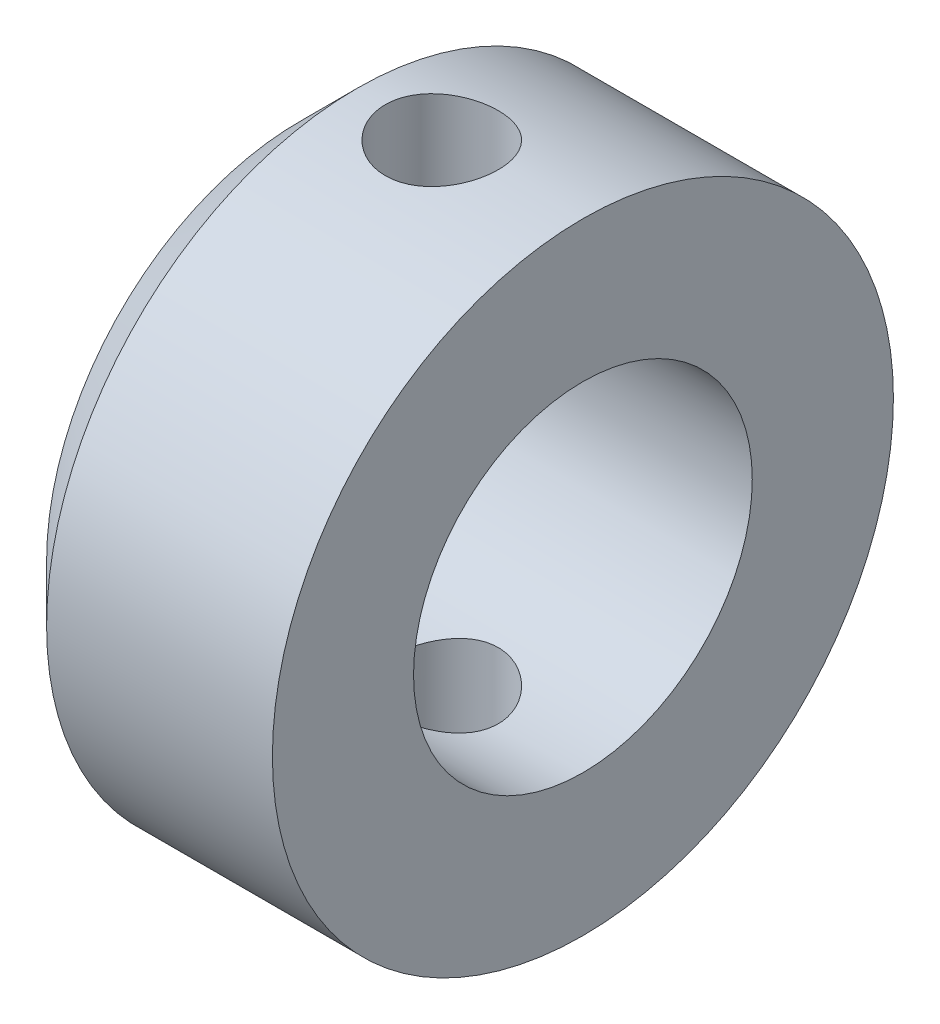
ISO-10303-21;
HEADER;
FILE_DESCRIPTION(('STEP AP214'),'2;1');
FILE_NAME('part.step','',(''),(''),'','','');
FILE_SCHEMA(('AUTOMOTIVE_DESIGN { 1 0 10303 214 1 1 1 1 }'));
ENDSEC;
DATA;
#1=APPLICATION_CONTEXT('core data for automotive mechanical design processes');
#2=APPLICATION_PROTOCOL_DEFINITION('international standard','automotive_design',2000,#1);
#3=PRODUCT_CONTEXT('',#1,'mechanical');
#4=PRODUCT('Part','Part','',(#3));
#5=PRODUCT_RELATED_PRODUCT_CATEGORY('part','',(#4));
#6=PRODUCT_DEFINITION_FORMATION('','',#4);
#7=PRODUCT_DEFINITION_CONTEXT('part definition',#1,'design');
#8=PRODUCT_DEFINITION('design','',#6,#7);
#9=PRODUCT_DEFINITION_SHAPE('','',#8);
#10=(LENGTH_UNIT() NAMED_UNIT(*) SI_UNIT(.MILLI.,.METRE.));
#11=(NAMED_UNIT(*) PLANE_ANGLE_UNIT() SI_UNIT($,.RADIAN.));
#12=(NAMED_UNIT(*) SI_UNIT($,.STERADIAN.) SOLID_ANGLE_UNIT());
#13=UNCERTAINTY_MEASURE_WITH_UNIT(LENGTH_MEASURE(1.E-05),#10,'distance_accuracy_value','');
#14=(GEOMETRIC_REPRESENTATION_CONTEXT(3) GLOBAL_UNCERTAINTY_ASSIGNED_CONTEXT((#13)) GLOBAL_UNIT_ASSIGNED_CONTEXT((#10,
#11,#12)) REPRESENTATION_CONTEXT('',''));
#15=CARTESIAN_POINT('',(0.,0.,0.));
#16=DIRECTION('',(0.,0.,1.));
#17=DIRECTION('',(1.,0.,0.));
#18=AXIS2_PLACEMENT_3D('',#15,#16,#17);
#19=CARTESIAN_POINT('',(0.,0.,0.));
#20=DIRECTION('',(1.,0.,0.));
#21=DIRECTION('',(0.,0.,-1.));
#22=AXIS2_PLACEMENT_3D('',#19,#20,#21);
#23=PLANE('',#22);
#24=CARTESIAN_POINT('',(0.,0.,0.));
#25=DIRECTION('',(-1.,0.,0.));
#26=DIRECTION('',(0.,0.,1.));
#27=AXIS2_PLACEMENT_3D('',#24,#25,#26);
#28=CIRCLE('',#27,6.);
#29=CARTESIAN_POINT('',(0.,0.,6.));
#30=VERTEX_POINT('',#29);
#31=EDGE_CURVE('E97',#30,#30,#28,.T.);
#32=ORIENTED_EDGE('',*,*,#31,.T.);
#33=EDGE_LOOP('',(#32));
#34=FACE_BOUND('',#33,.T.);
#35=CARTESIAN_POINT('',(0.,0.,0.));
#36=DIRECTION('',(1.,0.,0.));
#37=DIRECTION('',(0.,0.,-1.));
#38=AXIS2_PLACEMENT_3D('',#35,#36,#37);
#39=CIRCLE('',#38,11.);
#40=CARTESIAN_POINT('',(0.,0.,-11.));
#41=VERTEX_POINT('',#40);
#42=EDGE_CURVE('E52',#41,#41,#39,.T.);
#43=ORIENTED_EDGE('',*,*,#42,.T.);
#44=EDGE_LOOP('',(#43));
#45=FACE_BOUND('',#44,.T.);
#46=ADVANCED_FACE('F34',(#34,#45),#23,.T.);
#47=CARTESIAN_POINT('',(0.,0.,0.));
#48=DIRECTION('',(1.,0.,0.));
#49=DIRECTION('',(0.,0.,-1.));
#50=AXIS2_PLACEMENT_3D('',#47,#48,#49);
#51=CYLINDRICAL_SURFACE('',#50,11.);
#52=CARTESIAN_POINT('',(-3.,-11.,0.));
#53=CARTESIAN_POINT('',(-3.00000431866068,-10.9999980072786,0.111357271644373));
#54=CARTESIAN_POINT('',(-3.00933175748266,-10.9982915273343,0.222771449918202));
#55=CARTESIAN_POINT('',(-3.04637346602493,-10.99164847502,0.442464406848309));
#56=CARTESIAN_POINT('',(-3.07410364858137,-10.9867091072254,0.550740387266074));
#57=CARTESIAN_POINT('',(-3.14707712967099,-10.9741532323507,0.760947572513747));
#58=CARTESIAN_POINT('',(-3.19230503218977,-10.9665390793192,0.862884263930173));
#59=CARTESIAN_POINT('',(-3.29894733119179,-10.949466714983,1.0577120033845));
#60=CARTESIAN_POINT('',(-3.36036026518819,-10.9400086703132,1.15060386767905));
#61=CARTESIAN_POINT('',(-3.4983659096427,-10.9201743349983,1.32576444051238));
#62=CARTESIAN_POINT('',(-3.57510584198076,-10.9097897259708,1.40791622603345));
#63=CARTESIAN_POINT('',(-3.74127035408983,-10.8893349521181,1.55825357341079));
#64=CARTESIAN_POINT('',(-3.83069581168915,-10.8792648091126,1.62643816794977));
#65=CARTESIAN_POINT('',(-4.02051272945978,-10.8604984020977,1.74738695016477));
#66=CARTESIAN_POINT('',(-4.12098053523038,-10.851812871101,1.80003313265556));
#67=CARTESIAN_POINT('',(-4.32951865032397,-10.836915832769,1.88765546949978));
#68=CARTESIAN_POINT('',(-4.43758834402504,-10.8307041253674,1.92263305283275));
#69=CARTESIAN_POINT('',(-4.6570146493566,-10.8215415351671,1.97355197711315));
#70=CARTESIAN_POINT('',(-4.76832259170963,-10.8185558462234,1.98969666425445));
#71=CARTESIAN_POINT('',(-4.99210440731457,-10.8160783143231,2.00312248736688));
#72=CARTESIAN_POINT('',(-5.10457818151604,-10.8165861769405,2.00040521296643));
#73=CARTESIAN_POINT('',(-5.32603191413302,-10.8210066504918,1.97634934427));
#74=CARTESIAN_POINT('',(-5.43503786789573,-10.8248771281426,1.95524117699072));
#75=CARTESIAN_POINT('',(-5.64793501836717,-10.8355206127391,1.89536523340027));
#76=CARTESIAN_POINT('',(-5.75182600935179,-10.8422937363232,1.85659674743188));
#77=CARTESIAN_POINT('',(-5.95222279077874,-10.8580238155272,1.76227297789296));
#78=CARTESIAN_POINT('',(-6.04868344266613,-10.8669929171435,1.7066239037154));
#79=CARTESIAN_POINT('',(-6.2309847369453,-10.8860962201172,1.58018503374043));
#80=CARTESIAN_POINT('',(-6.31682436264624,-10.8962305328347,1.50939379023585));
#81=CARTESIAN_POINT('',(-6.47677899644438,-10.9167064080855,1.35343399418352));
#82=CARTESIAN_POINT('',(-6.55070168843692,-10.9270488181647,1.2680681726569));
#83=CARTESIAN_POINT('',(-6.68320513348084,-10.9466375043709,1.08604454069331));
#84=CARTESIAN_POINT('',(-6.74178574962127,-10.9558837707156,0.989386629498159));
#85=CARTESIAN_POINT('',(-6.84196738978503,-10.9722553782534,0.787327598497299));
#86=CARTESIAN_POINT('',(-6.88354926869598,-10.9793783255922,0.681916780395495));
#87=CARTESIAN_POINT('',(-6.94836319249371,-10.9906820547088,0.465448414462669));
#88=CARTESIAN_POINT('',(-6.97159706857391,-10.994863130091,0.354391431316066));
#89=CARTESIAN_POINT('',(-6.99878976191912,-10.9997719337866,0.1314386495785));
#90=CARTESIAN_POINT('',(-7.00301222345408,-11.0005468934114,0.0195760121089348));
#91=CARTESIAN_POINT('',(-6.99276820181851,-10.998686302475,-0.203257238970966));
#92=CARTESIAN_POINT('',(-6.97830257992826,-10.9960509090871,-0.314227893453081));
#93=CARTESIAN_POINT('',(-6.93131225043813,-10.9876950863245,-0.531297097592757));
#94=CARTESIAN_POINT('',(-6.89892013081718,-10.9819973157216,-0.637425297458317));
#95=CARTESIAN_POINT('',(-6.81713917147806,-10.9681529512222,-0.84274471375661));
#96=CARTESIAN_POINT('',(-6.7677492323023,-10.9600061989244,-0.941935480960947));
#97=CARTESIAN_POINT('',(-6.65278536219707,-10.9420497958484,-1.13169524707493));
#98=CARTESIAN_POINT('',(-6.58704931284408,-10.932223816146,-1.22216445208488));
#99=CARTESIAN_POINT('',(-6.44147962332891,-10.9120428807109,-1.39088213822347));
#100=CARTESIAN_POINT('',(-6.36164475058806,-10.9016878787851,-1.46912954974332));
#101=CARTESIAN_POINT('',(-6.18895311855151,-10.8814603955764,-1.6121773788768));
#102=CARTESIAN_POINT('',(-6.09594669347414,-10.8715955212189,-1.67679836741418));
#103=CARTESIAN_POINT('',(-5.90024381859352,-10.8536151008102,-1.78949986552014));
#104=CARTESIAN_POINT('',(-5.79754771531562,-10.8454994922354,-1.83758096630795));
#105=CARTESIAN_POINT('',(-5.58584925030826,-10.8319954461548,-1.91557945241746));
#106=CARTESIAN_POINT('',(-5.47687876926195,-10.8265943801675,-1.9455810786184));
#107=CARTESIAN_POINT('',(-5.25533701136893,-10.8191012654539,-1.98683040178554));
#108=CARTESIAN_POINT('',(-5.14276611515108,-10.8170088681136,-1.99808007453629));
#109=CARTESIAN_POINT('',(-4.91901462453636,-10.8163869388262,-2.00144313663184));
#110=CARTESIAN_POINT('',(-4.80783832856145,-10.8178047454411,-1.99383937001232));
#111=CARTESIAN_POINT('',(-4.58837636198258,-10.8239270874703,-1.96032846912814));
#112=CARTESIAN_POINT('',(-4.48009067650571,-10.8286316059701,-1.93442142905718));
#113=CARTESIAN_POINT('',(-4.26962380260463,-10.8407757208091,-1.86515567158476));
#114=CARTESIAN_POINT('',(-4.16743283977657,-10.8482107929975,-1.82182581019232));
#115=CARTESIAN_POINT('',(-3.97172555283527,-10.8649817751485,-1.71897473664822));
#116=CARTESIAN_POINT('',(-3.87820979115442,-10.8743178082294,-1.65945247569007));
#117=CARTESIAN_POINT('',(-3.70108712540438,-10.8940032465147,-1.52491543662799));
#118=CARTESIAN_POINT('',(-3.61763843012924,-10.9043650783111,-1.44969415553099));
#119=CARTESIAN_POINT('',(-3.46445291898781,-10.9248399206865,-1.28632651423364));
#120=CARTESIAN_POINT('',(-3.39471925960776,-10.9349528735191,-1.19817718680093));
#121=CARTESIAN_POINT('',(-3.27039970287652,-10.9538897429719,-1.0105711896463));
#122=CARTESIAN_POINT('',(-3.21594581481987,-10.9627021317343,-0.911025849790496));
#123=CARTESIAN_POINT('',(-3.12462078392595,-10.9779326099335,-0.704073905086345));
#124=CARTESIAN_POINT('',(-3.08773284072168,-10.9843529858473,-0.59667492548667));
#125=CARTESIAN_POINT('',(-3.04022456969781,-10.9927407037649,-0.407441749458405));
#126=CARTESIAN_POINT('',(-3.02516566703965,-10.9954478027358,-0.326725427276489));
#127=CARTESIAN_POINT('',(-3.0050519062051,-10.9990781643304,-0.164016342132203));
#128=CARTESIAN_POINT('',(-2.99999681895823,-11.0000014678,-0.082023608440833));
#129=CARTESIAN_POINT('',(-3.,-11.,0.));
#130=B_SPLINE_CURVE_WITH_KNOTS('',3,(#52,#53,#54,#55,#56,#57,#58,#59,#60,#61,#62,#63,#64,#65,
#66,#67,#68,#69,#70,#71,#72,#73,#74,#75,#76,#77,#78,#79,#80,#81,#82,#83,#84,#85,#86,#87,#88,#89,
#90,#91,#92,#93,#94,#95,#96,#97,#98,#99,#100,#101,#102,#103,#104,#105,#106,#107,#108,#109,#110,
#111,#112,#113,#114,#115,#116,#117,#118,#119,#120,#121,#122,#123,#124,#125,#126,#127,#128,#129),
.UNSPECIFIED.,.T.,.F.,(4,2,2,2,2,2,2,2,2,2,2,2,2,2,2,2,2,2,2,2,2,2,2,2,2,2,2,2,2,2,2,2,2,2,2,2,
2,2,4),(0.,0.333771891552332,0.667832772072589,1.00160038286674,1.3353378446015,
1.67245014596885,2.00958578663078,2.3492195220365,2.6888257845573,3.02473021172645,
3.36060633024203,3.69233367290895,4.02407434678871,4.35769306461625,4.69134369321255,
5.02993210441872,5.36852353704647,5.70749527023812,6.04643316861453,6.38065600997364,
6.71486344850797,7.0466314328543,7.37842088074221,7.71364226795666,8.04889297616123,
8.38831506130459,8.72772501252475,9.06554101076157,9.40332141303603,9.73606509730373,
10.0688070691931,10.4010002025896,10.733214857769,11.0701111453004,11.4070848782946,
11.7468860454293,12.0863615649817,12.3322171022956,12.5780670098676),.UNSPECIFIED.);
#131=CARTESIAN_POINT('',(-3.,-11.,0.));
#132=VERTEX_POINT('',#131);
#133=EDGE_CURVE('E79',#132,#132,#130,.T.);
#134=ORIENTED_EDGE('',*,*,#133,.F.);
#135=EDGE_LOOP('',(#134));
#136=FACE_BOUND('',#135,.T.);
#137=CARTESIAN_POINT('',(-5.,10.816653826392,2.));
#138=CARTESIAN_POINT('',(-4.88865987742704,10.8166559469823,1.99999566748834));
#139=CARTESIAN_POINT('',(-4.777262808712,10.818391586416,1.9906710042305));
#140=CARTESIAN_POINT('',(-4.55760538412703,10.825138630904,1.953641319662));
#141=CARTESIAN_POINT('',(-4.44934784033072,10.8301528833982,1.92592032102069));
#142=CARTESIAN_POINT('',(-4.23917968698149,10.8428709030557,1.85297369289719));
#143=CARTESIAN_POINT('',(-4.13726343469195,10.8505722376174,1.80776389192774));
#144=CARTESIAN_POINT('',(-3.94247010837104,10.8677937983012,1.70116425408316));
#145=CARTESIAN_POINT('',(-3.84959224198363,10.8773138647657,1.63977583726981));
#146=CARTESIAN_POINT('',(-3.67441655255825,10.8972247379328,1.50179524823966));
#147=CARTESIAN_POINT('',(-3.59223992576605,10.9076236306456,1.42505035347811));
#148=CARTESIAN_POINT('',(-3.44185443716558,10.9280489317643,1.25886539634162));
#149=CARTESIAN_POINT('',(-3.37364646635462,10.9380753163762,1.1694245247635));
#150=CARTESIAN_POINT('',(-3.25267268154977,10.9567122399244,0.979593418999868));
#151=CARTESIAN_POINT('',(-3.2000207300042,10.965312146403,0.879129490479889));
#152=CARTESIAN_POINT('',(-3.11238666697386,10.9800367733651,0.670599774437612));
#153=CARTESIAN_POINT('',(-3.07740318949064,10.98616168519,0.562534575326681));
#154=CARTESIAN_POINT('',(-3.02647276674455,10.9951891058833,0.34312483782086));
#155=CARTESIAN_POINT('',(-3.01032168567929,10.9981261454525,0.231829128518771));
#156=CARTESIAN_POINT('',(-2.9968788325376,11.0005658088946,0.0080714729659267));
#157=CARTESIAN_POINT('',(-2.99958554642845,11.0000687084839,-0.104390378935036));
#158=CARTESIAN_POINT('',(-3.02362414207791,10.9957231855211,-0.325889196140737));
#159=CARTESIAN_POINT('',(-3.04473625351444,10.9919143087691,-0.434950900053344));
#160=CARTESIAN_POINT('',(-3.10463919746151,10.9814174690798,-0.647957490603361));
#161=CARTESIAN_POINT('',(-3.14343064538623,10.974729405919,-0.751902198979601));
#162=CARTESIAN_POINT('',(-3.23780305977915,10.9591592037236,-0.952366225453844));
#163=CARTESIAN_POINT('',(-3.29347264403384,10.9502655302338,-1.04884289251746));
#164=CARTESIAN_POINT('',(-3.41995588992469,10.9312689682172,-1.23116763357292));
#165=CARTESIAN_POINT('',(-3.49077100293549,10.9211659638428,-1.31701468769822));
#166=CARTESIAN_POINT('',(-3.64674845457927,10.9006990809284,-1.47694445054394));
#167=CARTESIAN_POINT('',(-3.73210301791898,10.8903335415211,-1.55083959404949));
#168=CARTESIAN_POINT('',(-3.91409406392092,10.8706496206858,-1.68329271964165));
#169=CARTESIAN_POINT('',(-4.01073069276526,10.861331252829,-1.74185050296967));
#170=CARTESIAN_POINT('',(-4.21278251048682,10.8447947340983,-1.84201538249092));
#171=CARTESIAN_POINT('',(-4.31821083163979,10.8375798001274,-1.88359655385222));
#172=CARTESIAN_POINT('',(-4.53471744988837,10.8261173347694,-1.94840376886998));
#173=CARTESIAN_POINT('',(-4.64579514651115,10.8218694887144,-1.97163175896675));
#174=CARTESIAN_POINT('',(-4.86875980120541,10.8168840409274,-1.99880217851546));
#175=CARTESIAN_POINT('',(-4.98061293266964,10.8160975038278,-2.00301348489164));
#176=CARTESIAN_POINT('',(-5.20342455056108,10.8179929515389,-1.99275054778849));
#177=CARTESIAN_POINT('',(-5.31438307821397,10.8206747755886,-1.97827717035788));
#178=CARTESIAN_POINT('',(-5.53138034405228,10.8291592937867,-1.93128609638897));
#179=CARTESIAN_POINT('',(-5.63745038400803,10.8349378000789,-1.89890818855376));
#180=CARTESIAN_POINT('',(-5.84265971882844,10.8489439080076,-1.81717497571878));
#181=CARTESIAN_POINT('',(-5.94179852908567,10.8571716806773,-1.76781848506108));
#182=CARTESIAN_POINT('',(-6.13151919601524,10.8752613415266,-1.65290586187994));
#183=CARTESIAN_POINT('',(-6.22199611808438,10.8851400484298,-1.58717917941567));
#184=CARTESIAN_POINT('',(-6.39073369159775,10.9053706629202,-1.44162304950737));
#185=CARTESIAN_POINT('',(-6.46899331199965,10.91572261035,-1.36179241301325));
#186=CARTESIAN_POINT('',(-6.61207284614978,10.9358898604531,-1.18909630007261));
#187=CARTESIAN_POINT('',(-6.67671235536181,10.9456968282676,-1.09608023252377));
#188=CARTESIAN_POINT('',(-6.789446306083,10.9635308137777,-0.900352619793533));
#189=CARTESIAN_POINT('',(-6.83754135727717,10.9715578970606,-0.79764143206785));
#190=CARTESIAN_POINT('',(-6.91554803863644,10.9848917263157,-0.585948218345343));
#191=CARTESIAN_POINT('',(-6.94554990487653,10.9902119510479,-0.477000329353953));
#192=CARTESIAN_POINT('',(-6.98680734329716,10.9975899747809,-0.255506648963482));
#193=CARTESIAN_POINT('',(-6.99806476513671,10.9996480956777,-0.142961213679232));
#194=CARTESIAN_POINT('',(-7.00145252110552,11.0002641421388,0.0807996190288168));
#195=CARTESIAN_POINT('',(-6.99385588848469,10.9988720323112,0.192010837925448));
#196=CARTESIAN_POINT('',(-6.96034705357607,10.9928473390214,0.411544538990866));
#197=CARTESIAN_POINT('',(-6.93443500480099,10.9882147827193,0.519867045363826));
#198=CARTESIAN_POINT('',(-6.86514309651073,10.9762290690773,0.730415433440432));
#199=CARTESIAN_POINT('',(-6.82179065462445,10.96888018348,0.832650596646204));
#200=CARTESIAN_POINT('',(-6.71888059719124,10.9522592239203,1.02843701194217));
#201=CARTESIAN_POINT('',(-6.65932198372257,10.9429870315355,1.12198772879735));
#202=CARTESIAN_POINT('',(-6.5247423614381,10.9233859020729,1.29911459753549));
#203=CARTESIAN_POINT('',(-6.44952330461567,10.9130443794735,1.38253889858449));
#204=CARTESIAN_POINT('',(-6.28617048330647,10.8925517029222,1.53567622355087));
#205=CARTESIAN_POINT('',(-6.19803369143839,10.8824005942262,1.60538602436339));
#206=CARTESIAN_POINT('',(-6.01044032439888,10.8633428283932,1.72967671803608));
#207=CARTESIAN_POINT('',(-5.91089276068865,10.8544476470463,1.78412208501857));
#208=CARTESIAN_POINT('',(-5.70393672327402,10.8390461745677,1.87543058906983));
#209=CARTESIAN_POINT('',(-5.59653590839219,10.8325375922296,1.9123105996278));
#210=CARTESIAN_POINT('',(-5.40732331556775,10.8240281075057,1.95979896205519));
#211=CARTESIAN_POINT('',(-5.32663073739139,10.821278872104,1.97484899189766));
#212=CARTESIAN_POINT('',(-5.16396904796782,10.8175909727573,1.99495098425024));
#213=CARTESIAN_POINT('',(-5.08199996793035,10.8166522646159,2.00000319081575));
#214=CARTESIAN_POINT('',(-5.,10.816653826392,2.));
#215=B_SPLINE_CURVE_WITH_KNOTS('',3,(#137,#138,#139,#140,#141,#142,#143,#144,#145,#146,#147,
#148,#149,#150,#151,#152,#153,#154,#155,#156,#157,#158,#159,#160,#161,#162,#163,#164,#165,#166,
#167,#168,#169,#170,#171,#172,#173,#174,#175,#176,#177,#178,#179,#180,#181,#182,#183,#184,#185,
#186,#187,#188,#189,#190,#191,#192,#193,#194,#195,#196,#197,#198,#199,#200,#201,#202,#203,#204,
#205,#206,#207,#208,#209,#210,#211,#212,#213,#214),.UNSPECIFIED.,.T.,.F.,(4,2,2,2,2,2,2,2,2,2,2,
2,2,2,2,2,2,2,2,2,2,2,2,2,2,2,2,2,2,2,2,2,2,2,2,2,2,2,4),(0.,0.333720352628771,
0.667730923425361,1.00143989738151,1.33511959011686,1.6722993511526,2.00950061266478,
2.34911212511978,2.6886973772514,3.02456639415963,3.3604084455173,3.69229445292966,
4.02419201411038,4.35786328487979,4.69156654523441,5.03008350848145,5.36860485839155,
5.70764124486732,6.04664167012789,6.3808336464698,6.71501013332594,7.04661365662176,
7.37824034134338,7.71347820234125,8.04874433945132,8.38820522569594,8.72765360102077,
9.06539473675368,9.40310254298626,9.73594847886933,10.0687916249998,10.4011135484041,
10.7334559397116,11.0702887970716,11.4072007206838,11.7470154829573,12.0865031534681,
12.3322881015162,12.5780670496697),.UNSPECIFIED.);
#216=CARTESIAN_POINT('',(-5.,10.816653826392,2.));
#217=VERTEX_POINT('',#216);
#218=EDGE_CURVE('E73',#217,#217,#215,.T.);
#219=ORIENTED_EDGE('',*,*,#218,.F.);
#220=EDGE_LOOP('',(#219));
#221=FACE_BOUND('',#220,.T.);
#222=CARTESIAN_POINT('',(-7.99999999999999,0.,0.));
#223=DIRECTION('',(-1.,0.,0.));
#224=DIRECTION('',(0.,0.,1.));
#225=AXIS2_PLACEMENT_3D('',#222,#223,#224);
#226=CIRCLE('',#225,11.);
#227=CARTESIAN_POINT('',(-7.99999999999999,0.,11.));
#228=VERTEX_POINT('',#227);
#229=EDGE_CURVE('E47',#228,#228,#226,.F.);
#230=ORIENTED_EDGE('',*,*,#229,.T.);
#231=EDGE_LOOP('',(#230));
#232=FACE_BOUND('',#231,.T.);
#233=ORIENTED_EDGE('',*,*,#42,.F.);
#234=EDGE_LOOP('',(#233));
#235=FACE_BOUND('',#234,.T.);
#236=ADVANCED_FACE('F84',(#136,#221,#232,#235),#51,.T.);
#237=CARTESIAN_POINT('',(-9.99999999999999,11.,0.));
#238=DIRECTION('',(-1.,0.,0.));
#239=DIRECTION('',(0.,0.,1.));
#240=AXIS2_PLACEMENT_3D('',#237,#238,#239);
#241=PLANE('',#240);
#242=CARTESIAN_POINT('',(-9.99999999999999,0.,0.));
#243=DIRECTION('',(-1.,0.,0.));
#244=DIRECTION('',(0.,0.,1.));
#245=AXIS2_PLACEMENT_3D('',#242,#243,#244);
#246=CIRCLE('',#245,6.);
#247=CARTESIAN_POINT('',(-9.99999999999999,0.,6.));
#248=VERTEX_POINT('',#247);
#249=EDGE_CURVE('E101',#248,#248,#246,.T.);
#250=ORIENTED_EDGE('',*,*,#249,.F.);
#251=EDGE_LOOP('',(#250));
#252=FACE_BOUND('',#251,.T.);
#253=CARTESIAN_POINT('',(-9.99999999999999,0.,0.));
#254=DIRECTION('',(-1.,0.,0.));
#255=DIRECTION('',(0.,0.,1.));
#256=AXIS2_PLACEMENT_3D('',#253,#254,#255);
#257=CIRCLE('',#256,8.99999999999999);
#258=CARTESIAN_POINT('',(-9.99999999999999,0.,8.99999999999999));
#259=VERTEX_POINT('',#258);
#260=EDGE_CURVE('E10',#259,#259,#257,.T.);
#261=ORIENTED_EDGE('',*,*,#260,.T.);
#262=EDGE_LOOP('',(#261));
#263=FACE_BOUND('',#262,.T.);
#264=ADVANCED_FACE('F87',(#252,#263),#241,.T.);
#265=CARTESIAN_POINT('',(-7.99999999999999,0.,0.));
#266=DIRECTION('',(1.,0.,0.));
#267=DIRECTION('',(0.,0.,-1.));
#268=AXIS2_PLACEMENT_3D('',#265,#266,#267);
#269=CONICAL_SURFACE('',#268,11.,0.78539816339745);
#270=ORIENTED_EDGE('',*,*,#260,.F.);
#271=EDGE_LOOP('',(#270));
#272=FACE_BOUND('',#271,.T.);
#273=ORIENTED_EDGE('',*,*,#229,.F.);
#274=EDGE_LOOP('',(#273));
#275=FACE_BOUND('',#274,.T.);
#276=ADVANCED_FACE('F36',(#272,#275),#269,.T.);
#277=CARTESIAN_POINT('',(0.,0.,0.));
#278=DIRECTION('',(-1.,0.,0.));
#279=DIRECTION('',(0.,0.,1.));
#280=AXIS2_PLACEMENT_3D('',#277,#278,#279);
#281=CYLINDRICAL_SURFACE('',#280,6.);
#282=CARTESIAN_POINT('',(-5.,-5.65685424949238,2.));
#283=CARTESIAN_POINT('',(-5.10893634967215,-5.65685389060868,2.00000051589543));
#284=CARTESIAN_POINT('',(-5.21786959964719,-5.66003538581715,1.99106956737105));
#285=CARTESIAN_POINT('',(-5.4325088419885,-5.6723514816251,1.95570226337762));
#286=CARTESIAN_POINT('',(-5.53821429974494,-5.68148706284378,1.92926302433679));
#287=CARTESIAN_POINT('',(-5.74325378599458,-5.70456407377583,1.85991097136981));
#288=CARTESIAN_POINT('',(-5.84259985888543,-5.71849607942643,1.8170304428065));
#289=CARTESIAN_POINT('',(-6.03272009709592,-5.74958244020649,1.71612325688277));
#290=CARTESIAN_POINT('',(-6.12349236510726,-5.76673750607225,1.65809325772037));
#291=CARTESIAN_POINT('',(-6.29743992467662,-5.80308978814947,1.52610229288576));
#292=CARTESIAN_POINT('',(-6.38023085734346,-5.82233789689288,1.45164868275584));
#293=CARTESIAN_POINT('',(-6.53241360244928,-5.86027729602006,1.28997533442879));
#294=CARTESIAN_POINT('',(-6.60180326316474,-5.87896849657924,1.20275355010475));
#295=CARTESIAN_POINT('',(-6.72695779465919,-5.91427733843598,1.01520901593002));
#296=CARTESIAN_POINT('',(-6.78231994123592,-5.93082815403211,0.914603822449053));
#297=CARTESIAN_POINT('',(-6.87518317025502,-5.95939173541966,0.70486244597495));
#298=CARTESIAN_POINT('',(-6.91268906635381,-5.97140572406004,0.595728571374425));
#299=CARTESIAN_POINT('',(-6.96747170926478,-5.98918150863814,0.376057634866989));
#300=CARTESIAN_POINT('',(-6.98540689251402,-5.99514629555118,0.265701509705937));
#301=CARTESIAN_POINT('',(-7.00263258672133,-6.00087216436496,0.0433957496481798));
#302=CARTESIAN_POINT('',(-7.00192790330483,-6.00063484525791,-0.0685534670877919));
#303=CARTESIAN_POINT('',(-6.98231149086795,-5.99412079237463,-0.286207030387629));
#304=CARTESIAN_POINT('',(-6.96411494305103,-5.98808129510235,-0.391984097183313));
#305=CARTESIAN_POINT('',(-6.91121403803906,-5.97093934679463,-0.598886877644343));
#306=CARTESIAN_POINT('',(-6.87650856204035,-5.95983655262364,-0.70001227555843));
#307=CARTESIAN_POINT('',(-6.79115736538788,-5.93351340586449,-0.896304949683946));
#308=CARTESIAN_POINT('',(-6.74030812290698,-5.91824085048031,-0.991376441937693));
#309=CARTESIAN_POINT('',(-6.62428058910269,-5.88516786077838,-1.17184865105465));
#310=CARTESIAN_POINT('',(-6.55909831334474,-5.86736672402934,-1.25724666877068));
#311=CARTESIAN_POINT('',(-6.4126512130806,-5.83012383699794,-1.42020173310261));
#312=CARTESIAN_POINT('',(-6.33077368431704,-5.81064430337755,-1.49720031413054));
#313=CARTESIAN_POINT('',(-6.15510254854677,-5.77294670497801,-1.63655451919635));
#314=CARTESIAN_POINT('',(-6.06130710854392,-5.75472883491231,-1.69890788656309));
#315=CARTESIAN_POINT('',(-5.86269274879313,-5.72141050242225,-1.80797491007149));
#316=CARTESIAN_POINT('',(-5.75773573736446,-5.70635818569496,-1.85445292724268));
#317=CARTESIAN_POINT('',(-5.54085721157117,-5.6816330164877,-1.92888638653867));
#318=CARTESIAN_POINT('',(-5.42893863758751,-5.67195790974186,-1.95684959149499));
#319=CARTESIAN_POINT('',(-5.20672328917686,-5.6595927263117,-1.99232256419504));
#320=CARTESIAN_POINT('',(-5.09658115050269,-5.65660720637512,-2.00069819101526));
#321=CARTESIAN_POINT('',(-4.87644770177179,-5.65713344118369,-1.99921087781944));
#322=CARTESIAN_POINT('',(-4.76645636795202,-5.66064401583629,-1.98935125045353));
#323=CARTESIAN_POINT('',(-4.55368606857618,-5.67347236180599,-1.95245130310462));
#324=CARTESIAN_POINT('',(-4.45078913969832,-5.68258650881681,-1.92601278796136));
#325=CARTESIAN_POINT('',(-4.25091278752163,-5.70537107342046,-1.85742772512093));
#326=CARTESIAN_POINT('',(-4.15393441681843,-5.7190422986968,-1.81527839272684));
#327=CARTESIAN_POINT('',(-3.965239158306,-5.74993755191574,-1.71494868147787));
#328=CARTESIAN_POINT('',(-3.8737867147164,-5.76726051331257,-1.65630223671699));
#329=CARTESIAN_POINT('',(-3.70170789523256,-5.80331537461931,-1.52517126111511));
#330=CARTESIAN_POINT('',(-3.62108472267755,-5.82204768887589,-1.45268265099756));
#331=CARTESIAN_POINT('',(-3.46894403181872,-5.85990077275699,-1.29178341180065));
#332=CARTESIAN_POINT('',(-3.3980512199623,-5.87899687155793,-1.2027745410933));
#333=CARTESIAN_POINT('',(-3.27216771530392,-5.91453703226218,-1.01365458280051));
#334=CARTESIAN_POINT('',(-3.21717645767515,-5.9309811883539,-0.913543889729103));
#335=CARTESIAN_POINT('',(-3.12515979027657,-5.95928811621206,-0.705559724864592));
#336=CARTESIAN_POINT('',(-3.08801744570387,-5.97118060009062,-0.597742246642392));
#337=CARTESIAN_POINT('',(-3.0325445158798,-5.98917221675549,-0.376916931692031));
#338=CARTESIAN_POINT('',(-3.01420714023899,-5.99527344068038,-0.263910983907778));
#339=CARTESIAN_POINT('',(-2.99747584478871,-6.00083726472513,-0.0416306717200817));
#340=CARTESIAN_POINT('',(-2.99818509213525,-6.00059840178878,0.0675694478400372));
#341=CARTESIAN_POINT('',(-3.01731461629282,-5.99424393038796,0.284222290000348));
#342=CARTESIAN_POINT('',(-3.03573345630554,-5.98812879867152,0.391675153638114));
#343=CARTESIAN_POINT('',(-3.08916446915193,-5.97081829908825,0.600084238864118));
#344=CARTESIAN_POINT('',(-3.12390843070587,-5.95970516722297,0.701116541825577));
#345=CARTESIAN_POINT('',(-3.20875506219431,-5.9335432140899,0.895956701879591));
#346=CARTESIAN_POINT('',(-3.25886051039403,-5.91849368096033,0.989763248284865));
#347=CARTESIAN_POINT('',(-3.37513902420402,-5.88531737655762,1.17126803261757));
#348=CARTESIAN_POINT('',(-3.44183737076328,-5.86709744983853,1.25861250311521));
#349=CARTESIAN_POINT('',(-3.58851478231239,-5.82985977583759,1.42116205254485));
#350=CARTESIAN_POINT('',(-3.66849808452545,-5.81084177546195,1.49636324324919));
#351=CARTESIAN_POINT('',(-3.84321871117389,-5.77326559651197,1.63548361766624));
#352=CARTESIAN_POINT('',(-3.93841102195328,-5.75475455977261,1.6988459319958));
#353=CARTESIAN_POINT('',(-4.13866885380556,-5.72120386646031,1.80862868660223));
#354=CARTESIAN_POINT('',(-4.24373178605933,-5.70616330322499,1.85505355363895));
#355=CARTESIAN_POINT('',(-4.45592364803126,-5.6820266841303,1.92768765640833));
#356=CARTESIAN_POINT('',(-4.56274452705073,-5.67269265714365,1.95471581829904));
#357=CARTESIAN_POINT('',(-4.7797121009334,-5.66010767079036,1.99086864029853));
#358=CARTESIAN_POINT('',(-4.88985763482142,-5.65685461234923,1.99999947839319));
#359=CARTESIAN_POINT('',(-5.,-5.65685424949238,2.));
#360=B_SPLINE_CURVE_WITH_KNOTS('',3,(#282,#283,#284,#285,#286,#287,#288,#289,#290,#291,#292,
#293,#294,#295,#296,#297,#298,#299,#300,#301,#302,#303,#304,#305,#306,#307,#308,#309,#310,#311,
#312,#313,#314,#315,#316,#317,#318,#319,#320,#321,#322,#323,#324,#325,#326,#327,#328,#329,#330,
#331,#332,#333,#334,#335,#336,#337,#338,#339,#340,#341,#342,#343,#344,#345,#346,#347,#348,#349,
#350,#351,#352,#353,#354,#355,#356,#357,#358,#359),.UNSPECIFIED.,.T.,.F.,(4,2,2,2,2,2,2,2,2,2,2,
2,2,2,2,2,2,2,2,2,2,2,2,2,2,2,2,2,2,2,2,2,2,2,2,2,2,2,4),(0.,0.326401169598711,
0.652856110030323,0.978673255001649,1.30456233237088,1.64202674855136,1.97954530343976,
2.32587012287314,2.67210152773578,3.00628637529868,3.34038506604654,3.66138009651138,
3.98239688378473,4.3076330972067,4.63295983748044,4.97360348727835,5.31429959224211,
5.6598527968611,6.00526102713231,6.33508582728879,6.66485071674468,6.98328791537553,
7.30178158293892,7.6303771547143,7.95906971324255,8.30357616342186,8.64807037515065,
8.99027582381703,9.33235766008313,9.65836169355271,9.98433928019562,10.3051391208086,
10.6259970152649,10.9587103904127,11.2915300886526,11.6373780547229,11.9831355653373,
12.3132642432538,12.6432789438093),.UNSPECIFIED.);
#361=CARTESIAN_POINT('',(-5.,-5.65685424949238,2.));
#362=VERTEX_POINT('',#361);
#363=EDGE_CURVE('E38',#362,#362,#360,.T.);
#364=ORIENTED_EDGE('',*,*,#363,.T.);
#365=EDGE_LOOP('',(#364));
#366=FACE_BOUND('',#365,.T.);
#367=CARTESIAN_POINT('',(-5.,5.65685424949238,2.));
#368=CARTESIAN_POINT('',(-4.89106365032786,5.65685389060868,2.00000051589543));
#369=CARTESIAN_POINT('',(-4.78213040035282,5.66003538581715,1.99106956737105));
#370=CARTESIAN_POINT('',(-4.5674911580115,5.6723514816251,1.95570226337762));
#371=CARTESIAN_POINT('',(-4.46178570025506,5.68148706284377,1.9292630243368));
#372=CARTESIAN_POINT('',(-4.25674621400542,5.70456407377583,1.85991097136981));
#373=CARTESIAN_POINT('',(-4.15740014111457,5.71849607942644,1.81703044280649));
#374=CARTESIAN_POINT('',(-3.96727990290408,5.74958244020649,1.71612325688276));
#375=CARTESIAN_POINT('',(-3.87650763489274,5.76673750607224,1.65809325772037));
#376=CARTESIAN_POINT('',(-3.70256007532337,5.80308978814946,1.52610229288576));
#377=CARTESIAN_POINT('',(-3.61976914265655,5.82233789689288,1.45164868275584));
#378=CARTESIAN_POINT('',(-3.46758639755072,5.86027729602006,1.28997533442879));
#379=CARTESIAN_POINT('',(-3.39819673683526,5.87896849657923,1.20275355010475));
#380=CARTESIAN_POINT('',(-3.27304220534081,5.91427733843598,1.01520901593002));
#381=CARTESIAN_POINT('',(-3.21768005876409,5.93082815403211,0.914603822449049));
#382=CARTESIAN_POINT('',(-3.12481682974498,5.95939173541966,0.704862445974945));
#383=CARTESIAN_POINT('',(-3.08731093364618,5.97140572406004,0.595728571374424));
#384=CARTESIAN_POINT('',(-3.03252829073521,5.98918150863813,0.37605763486699));
#385=CARTESIAN_POINT('',(-3.01459310748599,5.99514629555118,0.265701509705937));
#386=CARTESIAN_POINT('',(-2.99736741327869,6.00087216436496,0.0433957496481786));
#387=CARTESIAN_POINT('',(-2.99807209669518,6.00063484525791,-0.0685534670877929));
#388=CARTESIAN_POINT('',(-3.01768850913206,5.99412079237463,-0.286207030387629));
#389=CARTESIAN_POINT('',(-3.03588505694898,5.98808129510235,-0.391984097183312));
#390=CARTESIAN_POINT('',(-3.08878596196095,5.97093934679463,-0.598886877644343));
#391=CARTESIAN_POINT('',(-3.12349143795965,5.95983655262363,-0.700012275558432));
#392=CARTESIAN_POINT('',(-3.20884263461211,5.93351340586448,-0.896304949683945));
#393=CARTESIAN_POINT('',(-3.25969187709303,5.91824085048031,-0.991376441937687));
#394=CARTESIAN_POINT('',(-3.37571941089731,5.88516786077838,-1.17184865105464));
#395=CARTESIAN_POINT('',(-3.44090168665526,5.86736672402933,-1.25724666877068));
#396=CARTESIAN_POINT('',(-3.58734878691939,5.83012383699793,-1.42020173310262));
#397=CARTESIAN_POINT('',(-3.66922631568296,5.81064430337755,-1.49720031413054));
#398=CARTESIAN_POINT('',(-3.84489745145324,5.77294670497801,-1.63655451919634));
#399=CARTESIAN_POINT('',(-3.93869289145609,5.75472883491231,-1.69890788656308));
#400=CARTESIAN_POINT('',(-4.13730725120688,5.72141050242224,-1.80797491007149));
#401=CARTESIAN_POINT('',(-4.24226426263555,5.70635818569496,-1.85445292724268));
#402=CARTESIAN_POINT('',(-4.45914278842884,5.6816330164877,-1.92888638653867));
#403=CARTESIAN_POINT('',(-4.57106136241249,5.67195790974185,-1.95684959149499));
#404=CARTESIAN_POINT('',(-4.79327671082315,5.6595927263117,-1.99232256419504));
#405=CARTESIAN_POINT('',(-4.90341884949731,5.65660720637512,-2.00069819101527));
#406=CARTESIAN_POINT('',(-5.12355229822821,5.65713344118369,-1.99921087781944));
#407=CARTESIAN_POINT('',(-5.23354363204797,5.66064401583629,-1.98935125045352));
#408=CARTESIAN_POINT('',(-5.44631393142382,5.67347236180599,-1.95245130310462));
#409=CARTESIAN_POINT('',(-5.54921086030168,5.68258650881681,-1.92601278796137));
#410=CARTESIAN_POINT('',(-5.74908721247837,5.70537107342046,-1.85742772512094));
#411=CARTESIAN_POINT('',(-5.84606558318156,5.71904229869679,-1.81527839272684));
#412=CARTESIAN_POINT('',(-6.034760841694,5.74993755191574,-1.71494868147787));
#413=CARTESIAN_POINT('',(-6.12621328528361,5.76726051331257,-1.656302236717));
#414=CARTESIAN_POINT('',(-6.29829210476744,5.8033153746193,-1.52517126111512));
#415=CARTESIAN_POINT('',(-6.37891527732244,5.82204768887589,-1.45268265099756));
#416=CARTESIAN_POINT('',(-6.53105596818128,5.85990077275698,-1.29178341180065));
#417=CARTESIAN_POINT('',(-6.60194878003771,5.87899687155793,-1.20277454109331));
#418=CARTESIAN_POINT('',(-6.72783228469609,5.91453703226217,-1.01365458280051));
#419=CARTESIAN_POINT('',(-6.78282354232485,5.93098118835389,-0.913543889729102));
#420=CARTESIAN_POINT('',(-6.87484020972343,5.95928811621206,-0.705559724864589));
#421=CARTESIAN_POINT('',(-6.91198255429614,5.97118060009062,-0.597742246642394));
#422=CARTESIAN_POINT('',(-6.96745548412021,5.98917221675549,-0.376916931692034));
#423=CARTESIAN_POINT('',(-6.985792859761,5.99527344068037,-0.263910983907778));
#424=CARTESIAN_POINT('',(-7.00252415521128,6.00083726472513,-0.0416306717200794));
#425=CARTESIAN_POINT('',(-7.00181490786476,6.00059840178878,0.0675694478400388));
#426=CARTESIAN_POINT('',(-6.98268538370719,5.99424393038796,0.284222290000349));
#427=CARTESIAN_POINT('',(-6.96426654369447,5.98812879867151,0.391675153638115));
#428=CARTESIAN_POINT('',(-6.91083553084808,5.97081829908824,0.60008423886412));
#429=CARTESIAN_POINT('',(-6.87609156929414,5.95970516722297,0.70111654182558));
#430=CARTESIAN_POINT('',(-6.79124493780569,5.9335432140899,0.895956701879593));
#431=CARTESIAN_POINT('',(-6.74113948960598,5.91849368096033,0.989763248284866));
#432=CARTESIAN_POINT('',(-6.62486097579599,5.88531737655762,1.17126803261757));
#433=CARTESIAN_POINT('',(-6.55816262923672,5.86709744983853,1.25861250311522));
#434=CARTESIAN_POINT('',(-6.41148521768761,5.82985977583759,1.42116205254486));
#435=CARTESIAN_POINT('',(-6.33150191547455,5.81084177546194,1.49636324324919));
#436=CARTESIAN_POINT('',(-6.1567812888261,5.77326559651196,1.63548361766624));
#437=CARTESIAN_POINT('',(-6.06158897804672,5.75475455977261,1.6988459319958));
#438=CARTESIAN_POINT('',(-5.86133114619444,5.72120386646031,1.80862868660223));
#439=CARTESIAN_POINT('',(-5.75626821394067,5.70616330322498,1.85505355363895));
#440=CARTESIAN_POINT('',(-5.54407635196874,5.68202668413029,1.92768765640833));
#441=CARTESIAN_POINT('',(-5.43725547294927,5.67269265714364,1.95471581829904));
#442=CARTESIAN_POINT('',(-5.2202878990666,5.66010767079036,1.99086864029853));
#443=CARTESIAN_POINT('',(-5.11014236517858,5.65685461234922,1.99999947839319));
#444=CARTESIAN_POINT('',(-5.,5.65685424949238,2.));
#445=B_SPLINE_CURVE_WITH_KNOTS('',3,(#367,#368,#369,#370,#371,#372,#373,#374,#375,#376,#377,
#378,#379,#380,#381,#382,#383,#384,#385,#386,#387,#388,#389,#390,#391,#392,#393,#394,#395,#396,
#397,#398,#399,#400,#401,#402,#403,#404,#405,#406,#407,#408,#409,#410,#411,#412,#413,#414,#415,
#416,#417,#418,#419,#420,#421,#422,#423,#424,#425,#426,#427,#428,#429,#430,#431,#432,#433,#434,
#435,#436,#437,#438,#439,#440,#441,#442,#443,#444),.UNSPECIFIED.,.T.,.F.,(4,2,2,2,2,2,2,2,2,2,2,
2,2,2,2,2,2,2,2,2,2,2,2,2,2,2,2,2,2,2,2,2,2,2,2,2,2,2,4),(0.,0.326401169598716,
0.652856110030337,0.978673255001662,1.30456233237089,1.64202674855137,1.97954530343977,
2.32587012287315,2.67210152773579,3.00628637529869,3.34038506604655,3.66138009651138,
3.98239688378474,4.3076330972067,4.63295983748044,4.97360348727836,5.31429959224212,
5.65985279686112,6.00526102713232,6.33508582728879,6.66485071674467,6.98328791537552,
7.30178158293892,7.6303771547143,7.95906971324255,8.30357616342186,8.64807037515065,
8.99027582381703,9.33235766008313,9.65836169355271,9.98433928019563,10.3051391208086,
10.6259970152649,10.9587103904127,11.2915300886526,11.6373780547229,11.9831355653373,
12.3132642432538,12.6432789438093),.UNSPECIFIED.);
#446=CARTESIAN_POINT('',(-5.,5.65685424949238,2.));
#447=VERTEX_POINT('',#446);
#448=EDGE_CURVE('E55',#447,#447,#445,.T.);
#449=ORIENTED_EDGE('',*,*,#448,.T.);
#450=EDGE_LOOP('',(#449));
#451=FACE_BOUND('',#450,.T.);
#452=ORIENTED_EDGE('',*,*,#31,.F.);
#453=EDGE_LOOP('',(#452));
#454=FACE_BOUND('',#453,.T.);
#455=ORIENTED_EDGE('',*,*,#249,.T.);
#456=EDGE_LOOP('',(#455));
#457=FACE_BOUND('',#456,.T.);
#458=ADVANCED_FACE('F60',(#366,#451,#454,#457),#281,.F.);
#459=CARTESIAN_POINT('',(-5.,-11.,0.));
#460=DIRECTION('',(0.,1.,0.));
#461=DIRECTION('',(0.,0.,1.));
#462=AXIS2_PLACEMENT_3D('',#459,#460,#461);
#463=CYLINDRICAL_SURFACE('',#462,2.);
#464=ORIENTED_EDGE('',*,*,#218,.T.);
#465=EDGE_LOOP('',(#464));
#466=FACE_BOUND('',#465,.T.);
#467=ORIENTED_EDGE('',*,*,#448,.F.);
#468=EDGE_LOOP('',(#467));
#469=FACE_BOUND('',#468,.T.);
#470=ADVANCED_FACE('F66',(#466,#469),#463,.F.);
#471=ORIENTED_EDGE('',*,*,#133,.T.);
#472=EDGE_LOOP('',(#471));
#473=FACE_BOUND('',#472,.T.);
#474=ORIENTED_EDGE('',*,*,#363,.F.);
#475=EDGE_LOOP('',(#474));
#476=FACE_BOUND('',#475,.T.);
#477=ADVANCED_FACE('F63',(#473,#476),#463,.F.);
#478=CLOSED_SHELL('',(#46,#236,#264,#276,#458,#470,#477));
#479=MANIFOLD_SOLID_BREP('B2',#478);
#480=ADVANCED_BREP_SHAPE_REPRESENTATION('',(#18,#479),#14);
#481=SHAPE_DEFINITION_REPRESENTATION(#9,#480);
ENDSEC;
END-ISO-10303-21;
